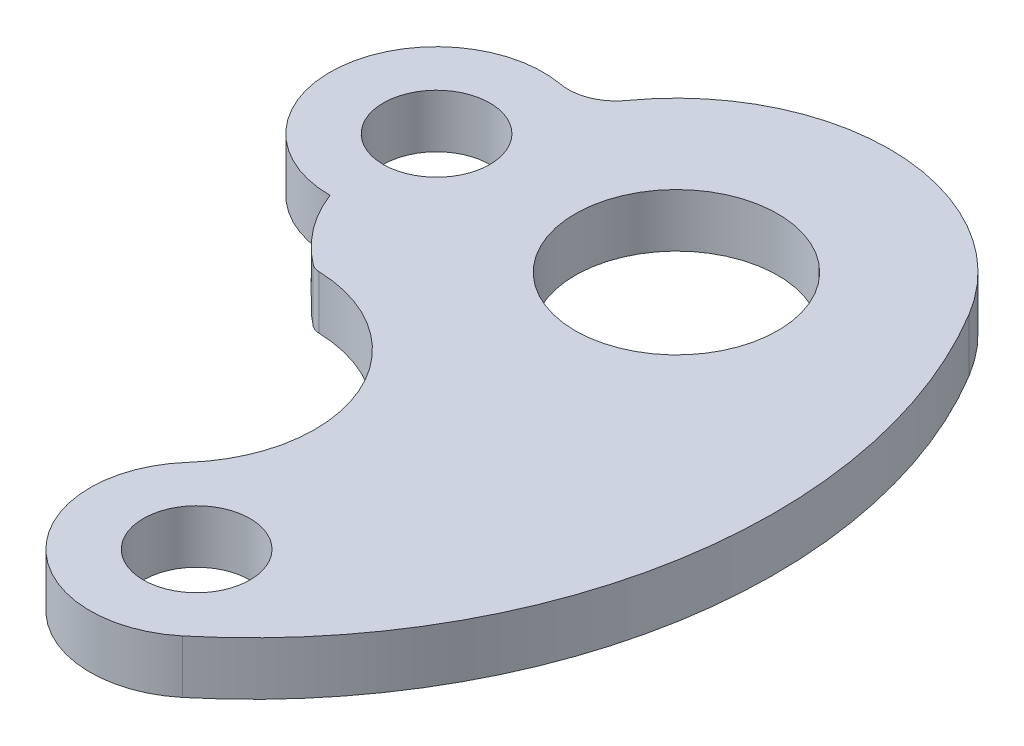
ISO-10303-21;
HEADER;
FILE_DESCRIPTION(('STEP AP214'),'2;1');
FILE_NAME('part.step','',(''),(''),'','','');
FILE_SCHEMA(('AUTOMOTIVE_DESIGN { 1 0 10303 214 1 1 1 1 }'));
ENDSEC;
DATA;
#1=APPLICATION_CONTEXT('core data for automotive mechanical design processes');
#2=APPLICATION_PROTOCOL_DEFINITION('international standard','automotive_design',2000,#1);
#3=PRODUCT_CONTEXT('',#1,'mechanical');
#4=PRODUCT('Part','Part','',(#3));
#5=PRODUCT_RELATED_PRODUCT_CATEGORY('part','',(#4));
#6=PRODUCT_DEFINITION_FORMATION('','',#4);
#7=PRODUCT_DEFINITION_CONTEXT('part definition',#1,'design');
#8=PRODUCT_DEFINITION('design','',#6,#7);
#9=PRODUCT_DEFINITION_SHAPE('','',#8);
#10=(LENGTH_UNIT() NAMED_UNIT(*) SI_UNIT(.MILLI.,.METRE.));
#11=(NAMED_UNIT(*) PLANE_ANGLE_UNIT() SI_UNIT($,.RADIAN.));
#12=(NAMED_UNIT(*) SI_UNIT($,.STERADIAN.) SOLID_ANGLE_UNIT());
#13=UNCERTAINTY_MEASURE_WITH_UNIT(LENGTH_MEASURE(1.E-05),#10,'distance_accuracy_value','');
#14=(GEOMETRIC_REPRESENTATION_CONTEXT(3) GLOBAL_UNCERTAINTY_ASSIGNED_CONTEXT((#13)) GLOBAL_UNIT_ASSIGNED_CONTEXT((#10,
#11,#12)) REPRESENTATION_CONTEXT('',''));
#15=CARTESIAN_POINT('',(0.,0.,0.));
#16=DIRECTION('',(0.,0.,1.));
#17=DIRECTION('',(1.,0.,0.));
#18=AXIS2_PLACEMENT_3D('',#15,#16,#17);
#19=CARTESIAN_POINT('',(-45.,10.,0.));
#20=DIRECTION('',(0.,-1.,0.));
#21=DIRECTION('',(0.,0.,-1.));
#22=AXIS2_PLACEMENT_3D('',#19,#20,#21);
#23=CYLINDRICAL_SURFACE('',#22,20.);
#24=CARTESIAN_POINT('',(-45.,0.,0.));
#25=DIRECTION('',(0.,1.,0.));
#26=DIRECTION('',(0.,0.,1.));
#27=AXIS2_PLACEMENT_3D('',#24,#25,#26);
#28=CIRCLE('',#27,20.);
#29=CARTESIAN_POINT('',(-41.4367816091954,0.,-19.6800273043365));
#30=VERTEX_POINT('',#29);
#31=CARTESIAN_POINT('',(-45.,0.,20.));
#32=VERTEX_POINT('',#31);
#33=EDGE_CURVE('E141',#30,#32,#28,.T.);
#34=ORIENTED_EDGE('',*,*,#33,.T.);
#35=DIRECTION('',(0.,-1.,0.));
#36=VECTOR('',#35,1.);
#37=CARTESIAN_POINT('',(-45.,10.,20.));
#38=LINE('',#37,#36);
#39=CARTESIAN_POINT('',(-45.,10.,20.));
#40=VERTEX_POINT('',#39);
#41=EDGE_CURVE('E11',#40,#32,#38,.T.);
#42=ORIENTED_EDGE('',*,*,#41,.F.);
#43=CARTESIAN_POINT('',(-45.,10.,0.));
#44=DIRECTION('',(0.,1.,0.));
#45=DIRECTION('',(0.,0.,1.));
#46=AXIS2_PLACEMENT_3D('',#43,#44,#45);
#47=CIRCLE('',#46,20.);
#48=CARTESIAN_POINT('',(-41.4367816091954,10.,-19.6800273043365));
#49=VERTEX_POINT('',#48);
#50=EDGE_CURVE('E193',#49,#40,#47,.T.);
#51=ORIENTED_EDGE('',*,*,#50,.F.);
#52=DIRECTION('',(0.,-1.,0.));
#53=VECTOR('',#52,1.);
#54=CARTESIAN_POINT('',(-41.4367816091954,10.,-19.6800273043365));
#55=LINE('',#54,#53);
#56=EDGE_CURVE('E50',#49,#30,#55,.T.);
#57=ORIENTED_EDGE('',*,*,#56,.T.);
#58=EDGE_LOOP('',(#34,#42,#51,#57));
#59=FACE_BOUND('',#58,.T.);
#60=ADVANCED_FACE('F33',(#59),#23,.T.);
#61=CARTESIAN_POINT('',(-45.,10.,20.));
#62=CARTESIAN_POINT('',(-42.9512956872842,10.,25.1834189093785));
#63=CARTESIAN_POINT('',(-39.7156239438247,10.,29.4632574497778));
#64=CARTESIAN_POINT('',(-35.2929847696208,10.,32.8395156211983));
#65=B_SPLINE_CURVE_WITH_KNOTS('',3,(#61,#62,#63,#64),.UNSPECIFIED.,.F.,.F.,(4,4),(0.,
0.944416844012333),.UNSPECIFIED.);
#66=DIRECTION('',(0.,-1.,0.));
#67=VECTOR('',#66,1.);
#68=SURFACE_OF_LINEAR_EXTRUSION('',#65,#67);
#69=CARTESIAN_POINT('',(-45.,0.,20.));
#70=CARTESIAN_POINT('',(-42.9512956872842,0.,25.1834189093785));
#71=CARTESIAN_POINT('',(-39.7156239438247,0.,29.4632574497778));
#72=CARTESIAN_POINT('',(-35.2929847696208,0.,32.8395156211983));
#73=B_SPLINE_CURVE_WITH_KNOTS('',3,(#69,#70,#71,#72),.UNSPECIFIED.,.F.,.F.,(4,4),(0.,
0.944416844012333),.UNSPECIFIED.);
#74=CARTESIAN_POINT('',(-35.2929847696208,0.,32.8395156211983));
#75=VERTEX_POINT('',#74);
#76=EDGE_CURVE('E143',#32,#75,#73,.T.);
#77=ORIENTED_EDGE('',*,*,#76,.T.);
#78=DIRECTION('',(0.,-1.,0.));
#79=VECTOR('',#78,1.);
#80=CARTESIAN_POINT('',(-35.2929847696208,10.,32.8395156211983));
#81=LINE('',#80,#79);
#82=CARTESIAN_POINT('',(-35.2929847696208,10.,32.8395156211983));
#83=VERTEX_POINT('',#82);
#84=EDGE_CURVE('E42',#83,#75,#81,.T.);
#85=ORIENTED_EDGE('',*,*,#84,.F.);
#86=EDGE_CURVE('E89',#40,#83,#65,.T.);
#87=ORIENTED_EDGE('',*,*,#86,.F.);
#88=ORIENTED_EDGE('',*,*,#41,.T.);
#89=EDGE_LOOP('',(#77,#85,#87,#88));
#90=FACE_BOUND('',#89,.T.);
#91=ADVANCED_FACE('F199',(#90),#68,.F.);
#92=CARTESIAN_POINT('',(-33.5217268424337,10.,30.5193036295004));
#93=DIRECTION('',(0.,-1.,0.));
#94=DIRECTION('',(0.,0.,-1.));
#95=AXIS2_PLACEMENT_3D('',#92,#93,#94);
#96=CYLINDRICAL_SURFACE('',#95,2.91903037514893);
#97=CARTESIAN_POINT('',(-33.5217268424337,0.,30.5193036295004));
#98=DIRECTION('',(0.,1.,0.));
#99=DIRECTION('',(0.,0.,1.));
#100=AXIS2_PLACEMENT_3D('',#97,#98,#99);
#101=CIRCLE('',#100,2.91903037514893);
#102=CARTESIAN_POINT('',(-33.6072452827485,0.,33.4370810246092));
#103=VERTEX_POINT('',#102);
#104=EDGE_CURVE('E147',#75,#103,#101,.T.);
#105=ORIENTED_EDGE('',*,*,#104,.T.);
#106=DIRECTION('',(0.,-1.,0.));
#107=VECTOR('',#106,1.);
#108=CARTESIAN_POINT('',(-33.6072452827485,10.,33.4370810246092));
#109=LINE('',#108,#107);
#110=CARTESIAN_POINT('',(-33.6072452827485,10.,33.4370810246092));
#111=VERTEX_POINT('',#110);
#112=EDGE_CURVE('E170',#111,#103,#109,.T.);
#113=ORIENTED_EDGE('',*,*,#112,.F.);
#114=CARTESIAN_POINT('',(-33.5217268424337,10.,30.5193036295004));
#115=DIRECTION('',(0.,1.,0.));
#116=DIRECTION('',(0.,0.,1.));
#117=AXIS2_PLACEMENT_3D('',#114,#115,#116);
#118=CIRCLE('',#117,2.91903037514893);
#119=EDGE_CURVE('E177',#83,#111,#118,.T.);
#120=ORIENTED_EDGE('',*,*,#119,.F.);
#121=ORIENTED_EDGE('',*,*,#84,.T.);
#122=EDGE_LOOP('',(#105,#113,#120,#121));
#123=FACE_BOUND('',#122,.T.);
#124=ADVANCED_FACE('F175',(#123),#96,.T.);
#125=CARTESIAN_POINT('',(-34.3689637859595,10.,59.4259206470677));
#126=DIRECTION('',(0.,-1.,0.));
#127=DIRECTION('',(0.,0.,-1.));
#128=AXIS2_PLACEMENT_3D('',#125,#126,#127);
#129=CYLINDRICAL_SURFACE('',#128,26.);
#130=CARTESIAN_POINT('',(-34.3689637859595,0.,59.4259206470677));
#131=DIRECTION('',(0.,1.,0.));
#132=DIRECTION('',(0.,0.,1.));
#133=AXIS2_PLACEMENT_3D('',#130,#131,#132);
#134=CIRCLE('',#133,26.);
#135=CARTESIAN_POINT('',(-14.9430277330259,0.,76.7069220204642));
#136=VERTEX_POINT('',#135);
#137=EDGE_CURVE('E153',#136,#103,#134,.T.);
#138=ORIENTED_EDGE('',*,*,#137,.F.);
#139=DIRECTION('',(0.,-1.,0.));
#140=VECTOR('',#139,1.);
#141=CARTESIAN_POINT('',(-14.9430277330259,10.,76.7069220204642));
#142=LINE('',#141,#140);
#143=CARTESIAN_POINT('',(-14.9430277330259,10.,76.7069220204642));
#144=VERTEX_POINT('',#143);
#145=EDGE_CURVE('E168',#144,#136,#142,.T.);
#146=ORIENTED_EDGE('',*,*,#145,.F.);
#147=CARTESIAN_POINT('',(-34.3689637859595,10.,59.4259206470677));
#148=DIRECTION('',(0.,1.,0.));
#149=DIRECTION('',(0.,0.,1.));
#150=AXIS2_PLACEMENT_3D('',#147,#148,#149);
#151=CIRCLE('',#150,26.);
#152=EDGE_CURVE('E185',#144,#111,#151,.T.);
#153=ORIENTED_EDGE('',*,*,#152,.T.);
#154=ORIENTED_EDGE('',*,*,#112,.T.);
#155=EDGE_LOOP('',(#138,#146,#153,#154));
#156=FACE_BOUND('',#155,.T.);
#157=ADVANCED_FACE('F183',(#156),#129,.F.);
#158=CARTESIAN_POINT('',(0.,10.,90.));
#159=DIRECTION('',(0.,-1.,0.));
#160=DIRECTION('',(0.,0.,-1.));
#161=AXIS2_PLACEMENT_3D('',#158,#159,#160);
#162=CYLINDRICAL_SURFACE('',#161,20.);
#163=CARTESIAN_POINT('',(0.,0.,90.));
#164=DIRECTION('',(0.,1.,0.));
#165=DIRECTION('',(0.,0.,1.));
#166=AXIS2_PLACEMENT_3D('',#163,#164,#165);
#167=CIRCLE('',#166,20.);
#168=CARTESIAN_POINT('',(12.7450453716141,0.,105.413105413105));
#169=VERTEX_POINT('',#168);
#170=EDGE_CURVE('E156',#136,#169,#167,.T.);
#171=ORIENTED_EDGE('',*,*,#170,.T.);
#172=DIRECTION('',(0.,-1.,0.));
#173=VECTOR('',#172,1.);
#174=CARTESIAN_POINT('',(12.7450453716141,10.,105.413105413105));
#175=LINE('',#174,#173);
#176=CARTESIAN_POINT('',(12.7450453716141,10.,105.413105413105));
#177=VERTEX_POINT('',#176);
#178=EDGE_CURVE('E124',#177,#169,#175,.T.);
#179=ORIENTED_EDGE('',*,*,#178,.F.);
#180=CARTESIAN_POINT('',(0.,10.,90.));
#181=DIRECTION('',(0.,1.,0.));
#182=DIRECTION('',(0.,0.,1.));
#183=AXIS2_PLACEMENT_3D('',#180,#181,#182);
#184=CIRCLE('',#183,20.);
#185=EDGE_CURVE('E112',#144,#177,#184,.T.);
#186=ORIENTED_EDGE('',*,*,#185,.F.);
#187=ORIENTED_EDGE('',*,*,#145,.T.);
#188=EDGE_LOOP('',(#171,#179,#186,#187));
#189=FACE_BOUND('',#188,.T.);
#190=ADVANCED_FACE('F241',(#189),#162,.T.);
#191=CARTESIAN_POINT('',(-49.7056769492948,10.,29.8888888888889));
#192=DIRECTION('',(0.,-1.,0.));
#193=DIRECTION('',(0.,0.,-1.));
#194=AXIS2_PLACEMENT_3D('',#191,#192,#193);
#195=CYLINDRICAL_SURFACE('',#194,98.);
#196=CARTESIAN_POINT('',(-49.7056769492948,0.,29.8888888888889));
#197=DIRECTION('',(0.,1.,0.));
#198=DIRECTION('',(0.,0.,1.));
#199=AXIS2_PLACEMENT_3D('',#196,#197,#198);
#200=CIRCLE('',#199,98.);
#201=CARTESIAN_POINT('',(34.2797772064102,0.,-20.6130268199234));
#202=VERTEX_POINT('',#201);
#203=EDGE_CURVE('E121',#169,#202,#200,.T.);
#204=ORIENTED_EDGE('',*,*,#203,.T.);
#205=DIRECTION('',(0.,-1.,0.));
#206=VECTOR('',#205,1.);
#207=CARTESIAN_POINT('',(34.2797772064102,10.,-20.6130268199234));
#208=LINE('',#207,#206);
#209=CARTESIAN_POINT('',(34.2797772064102,10.,-20.6130268199234));
#210=VERTEX_POINT('',#209);
#211=EDGE_CURVE('E118',#210,#202,#208,.T.);
#212=ORIENTED_EDGE('',*,*,#211,.F.);
#213=CARTESIAN_POINT('',(-49.7056769492948,10.,29.8888888888889));
#214=DIRECTION('',(0.,1.,0.));
#215=DIRECTION('',(0.,0.,1.));
#216=AXIS2_PLACEMENT_3D('',#213,#214,#215);
#217=CIRCLE('',#216,98.);
#218=EDGE_CURVE('E104',#177,#210,#217,.T.);
#219=ORIENTED_EDGE('',*,*,#218,.F.);
#220=ORIENTED_EDGE('',*,*,#178,.T.);
#221=EDGE_LOOP('',(#204,#212,#219,#220));
#222=FACE_BOUND('',#221,.T.);
#223=ADVANCED_FACE('F119',(#222),#195,.T.);
#224=CARTESIAN_POINT('',(0.,10.,0.));
#225=DIRECTION('',(0.,-1.,0.));
#226=DIRECTION('',(0.,0.,-1.));
#227=AXIS2_PLACEMENT_3D('',#224,#225,#226);
#228=CYLINDRICAL_SURFACE('',#227,40.);
#229=CARTESIAN_POINT('',(0.,0.,0.));
#230=DIRECTION('',(0.,1.,0.));
#231=DIRECTION('',(0.,0.,1.));
#232=AXIS2_PLACEMENT_3D('',#229,#230,#231);
#233=CIRCLE('',#232,40.);
#234=CARTESIAN_POINT('',(-32.5170068027211,0.,-23.2947261969698));
#235=VERTEX_POINT('',#234);
#236=EDGE_CURVE('E159',#202,#235,#233,.T.);
#237=ORIENTED_EDGE('',*,*,#236,.T.);
#238=DIRECTION('',(0.,-1.,0.));
#239=VECTOR('',#238,1.);
#240=CARTESIAN_POINT('',(-32.5170068027211,10.,-23.2947261969698));
#241=LINE('',#240,#239);
#242=CARTESIAN_POINT('',(-32.5170068027211,10.,-23.2947261969698));
#243=VERTEX_POINT('',#242);
#244=EDGE_CURVE('E77',#243,#235,#241,.T.);
#245=ORIENTED_EDGE('',*,*,#244,.F.);
#246=CARTESIAN_POINT('',(0.,10.,0.));
#247=DIRECTION('',(0.,1.,0.));
#248=DIRECTION('',(0.,0.,1.));
#249=AXIS2_PLACEMENT_3D('',#246,#247,#248);
#250=CIRCLE('',#249,40.);
#251=EDGE_CURVE('E109',#210,#243,#250,.T.);
#252=ORIENTED_EDGE('',*,*,#251,.F.);
#253=ORIENTED_EDGE('',*,*,#211,.T.);
#254=EDGE_LOOP('',(#237,#245,#252,#253));
#255=FACE_BOUND('',#254,.T.);
#256=ADVANCED_FACE('F126',(#255),#228,.T.);
#257=CARTESIAN_POINT('',(0.,10.,90.));
#258=DIRECTION('',(0.,-1.,0.));
#259=DIRECTION('',(0.,0.,-1.));
#260=AXIS2_PLACEMENT_3D('',#257,#258,#259);
#261=CYLINDRICAL_SURFACE('',#260,10.);
#262=CARTESIAN_POINT('',(0.,10.,90.));
#263=DIRECTION('',(0.,1.,0.));
#264=DIRECTION('',(0.,0.,1.));
#265=AXIS2_PLACEMENT_3D('',#262,#263,#264);
#266=CIRCLE('',#265,10.);
#267=CARTESIAN_POINT('',(0.,10.,100.));
#268=VERTEX_POINT('',#267);
#269=EDGE_CURVE('E321',#268,#268,#266,.T.);
#270=ORIENTED_EDGE('',*,*,#269,.T.);
#271=EDGE_LOOP('',(#270));
#272=FACE_BOUND('',#271,.T.);
#273=CARTESIAN_POINT('',(0.,0.,90.));
#274=DIRECTION('',(0.,1.,0.));
#275=DIRECTION('',(0.,0.,1.));
#276=AXIS2_PLACEMENT_3D('',#273,#274,#275);
#277=CIRCLE('',#276,10.);
#278=CARTESIAN_POINT('',(0.,0.,100.));
#279=VERTEX_POINT('',#278);
#280=EDGE_CURVE('E138',#279,#279,#277,.T.);
#281=ORIENTED_EDGE('',*,*,#280,.F.);
#282=EDGE_LOOP('',(#281));
#283=FACE_BOUND('',#282,.T.);
#284=ADVANCED_FACE('F206',(#272,#283),#261,.F.);
#285=CARTESIAN_POINT('',(-45.,10.,0.));
#286=DIRECTION('',(0.,-1.,0.));
#287=DIRECTION('',(0.,0.,-1.));
#288=AXIS2_PLACEMENT_3D('',#285,#286,#287);
#289=CYLINDRICAL_SURFACE('',#288,10.);
#290=CARTESIAN_POINT('',(-45.,10.,0.));
#291=DIRECTION('',(0.,1.,0.));
#292=DIRECTION('',(0.,0.,1.));
#293=AXIS2_PLACEMENT_3D('',#290,#291,#292);
#294=CIRCLE('',#293,10.);
#295=CARTESIAN_POINT('',(-45.,10.,10.));
#296=VERTEX_POINT('',#295);
#297=EDGE_CURVE('E220',#296,#296,#294,.T.);
#298=ORIENTED_EDGE('',*,*,#297,.T.);
#299=EDGE_LOOP('',(#298));
#300=FACE_BOUND('',#299,.T.);
#301=CARTESIAN_POINT('',(-45.,0.,0.));
#302=DIRECTION('',(0.,1.,0.));
#303=DIRECTION('',(0.,0.,1.));
#304=AXIS2_PLACEMENT_3D('',#301,#302,#303);
#305=CIRCLE('',#304,10.);
#306=CARTESIAN_POINT('',(-45.,0.,10.));
#307=VERTEX_POINT('',#306);
#308=EDGE_CURVE('E135',#307,#307,#305,.T.);
#309=ORIENTED_EDGE('',*,*,#308,.F.);
#310=EDGE_LOOP('',(#309));
#311=FACE_BOUND('',#310,.T.);
#312=ADVANCED_FACE('F208',(#300,#311),#289,.F.);
#313=CARTESIAN_POINT('',(0.,10.,0.));
#314=DIRECTION('',(0.,-1.,0.));
#315=DIRECTION('',(0.,0.,-1.));
#316=AXIS2_PLACEMENT_3D('',#313,#314,#315);
#317=CYLINDRICAL_SURFACE('',#316,19.);
#318=CARTESIAN_POINT('',(0.,10.,0.));
#319=DIRECTION('',(0.,1.,0.));
#320=DIRECTION('',(0.,0.,1.));
#321=AXIS2_PLACEMENT_3D('',#318,#319,#320);
#322=CIRCLE('',#321,19.);
#323=CARTESIAN_POINT('',(0.,10.,19.));
#324=VERTEX_POINT('',#323);
#325=EDGE_CURVE('E164',#324,#324,#322,.T.);
#326=ORIENTED_EDGE('',*,*,#325,.T.);
#327=EDGE_LOOP('',(#326));
#328=FACE_BOUND('',#327,.T.);
#329=CARTESIAN_POINT('',(0.,0.,0.));
#330=DIRECTION('',(0.,1.,0.));
#331=DIRECTION('',(0.,0.,1.));
#332=AXIS2_PLACEMENT_3D('',#329,#330,#331);
#333=CIRCLE('',#332,19.);
#334=CARTESIAN_POINT('',(0.,0.,19.));
#335=VERTEX_POINT('',#334);
#336=EDGE_CURVE('E132',#335,#335,#333,.T.);
#337=ORIENTED_EDGE('',*,*,#336,.F.);
#338=EDGE_LOOP('',(#337));
#339=FACE_BOUND('',#338,.T.);
#340=ADVANCED_FACE('F35',(#328,#339),#317,.F.);
#341=CARTESIAN_POINT('',(-39.8333333333333,10.,-28.536039591288));
#342=DIRECTION('',(0.,-1.,0.));
#343=DIRECTION('',(0.,0.,-1.));
#344=AXIS2_PLACEMENT_3D('',#341,#342,#343);
#345=CYLINDRICAL_SURFACE('',#344,9.00000000000001);
#346=CARTESIAN_POINT('',(-39.8333333333333,0.,-28.536039591288));
#347=DIRECTION('',(0.,1.,0.));
#348=DIRECTION('',(0.,0.,1.));
#349=AXIS2_PLACEMENT_3D('',#346,#347,#348);
#350=CIRCLE('',#349,9.00000000000001);
#351=EDGE_CURVE('E161',#30,#235,#350,.T.);
#352=ORIENTED_EDGE('',*,*,#351,.F.);
#353=ORIENTED_EDGE('',*,*,#56,.F.);
#354=CARTESIAN_POINT('',(-39.8333333333333,10.,-28.536039591288));
#355=DIRECTION('',(0.,1.,0.));
#356=DIRECTION('',(0.,0.,1.));
#357=AXIS2_PLACEMENT_3D('',#354,#355,#356);
#358=CIRCLE('',#357,9.00000000000001);
#359=EDGE_CURVE('E127',#49,#243,#358,.T.);
#360=ORIENTED_EDGE('',*,*,#359,.T.);
#361=ORIENTED_EDGE('',*,*,#244,.T.);
#362=EDGE_LOOP('',(#352,#353,#360,#361));
#363=FACE_BOUND('',#362,.T.);
#364=ADVANCED_FACE('F215',(#363),#345,.F.);
#365=CARTESIAN_POINT('',(0.,10.,0.));
#366=DIRECTION('',(0.,1.,0.));
#367=DIRECTION('',(0.,0.,1.));
#368=AXIS2_PLACEMENT_3D('',#365,#366,#367);
#369=PLANE('',#368);
#370=ORIENTED_EDGE('',*,*,#325,.F.);
#371=EDGE_LOOP('',(#370));
#372=FACE_BOUND('',#371,.T.);
#373=ORIENTED_EDGE('',*,*,#297,.F.);
#374=EDGE_LOOP('',(#373));
#375=FACE_BOUND('',#374,.T.);
#376=ORIENTED_EDGE('',*,*,#269,.F.);
#377=EDGE_LOOP('',(#376));
#378=FACE_BOUND('',#377,.T.);
#379=ORIENTED_EDGE('',*,*,#50,.T.);
#380=ORIENTED_EDGE('',*,*,#86,.T.);
#381=ORIENTED_EDGE('',*,*,#119,.T.);
#382=ORIENTED_EDGE('',*,*,#152,.F.);
#383=ORIENTED_EDGE('',*,*,#185,.T.);
#384=ORIENTED_EDGE('',*,*,#218,.T.);
#385=ORIENTED_EDGE('',*,*,#251,.T.);
#386=ORIENTED_EDGE('',*,*,#359,.F.);
#387=EDGE_LOOP('',(#379,#380,#381,#382,#383,#384,#385,#386));
#388=FACE_BOUND('',#387,.T.);
#389=ADVANCED_FACE('F106',(#372,#375,#378,#388),#369,.T.);
#390=CARTESIAN_POINT('',(0.,0.,0.));
#391=DIRECTION('',(0.,1.,0.));
#392=DIRECTION('',(0.,0.,1.));
#393=AXIS2_PLACEMENT_3D('',#390,#391,#392);
#394=PLANE('',#393);
#395=ORIENTED_EDGE('',*,*,#336,.T.);
#396=EDGE_LOOP('',(#395));
#397=FACE_BOUND('',#396,.T.);
#398=ORIENTED_EDGE('',*,*,#308,.T.);
#399=EDGE_LOOP('',(#398));
#400=FACE_BOUND('',#399,.T.);
#401=ORIENTED_EDGE('',*,*,#280,.T.);
#402=EDGE_LOOP('',(#401));
#403=FACE_BOUND('',#402,.T.);
#404=ORIENTED_EDGE('',*,*,#33,.F.);
#405=ORIENTED_EDGE('',*,*,#351,.T.);
#406=ORIENTED_EDGE('',*,*,#236,.F.);
#407=ORIENTED_EDGE('',*,*,#203,.F.);
#408=ORIENTED_EDGE('',*,*,#170,.F.);
#409=ORIENTED_EDGE('',*,*,#137,.T.);
#410=ORIENTED_EDGE('',*,*,#104,.F.);
#411=ORIENTED_EDGE('',*,*,#76,.F.);
#412=EDGE_LOOP('',(#404,#405,#406,#407,#408,#409,#410,#411));
#413=FACE_BOUND('',#412,.T.);
#414=ADVANCED_FACE('F179',(#397,#400,#403,#413),#394,.F.);
#415=CLOSED_SHELL('',(#60,#91,#124,#157,#190,#223,#256,#284,#312,#340,#364,#389,#414));
#416=MANIFOLD_SOLID_BREP('B2',#415);
#417=ADVANCED_BREP_SHAPE_REPRESENTATION('',(#18,#416),#14);
#418=SHAPE_DEFINITION_REPRESENTATION(#9,#417);
ENDSEC;
END-ISO-10303-21;
